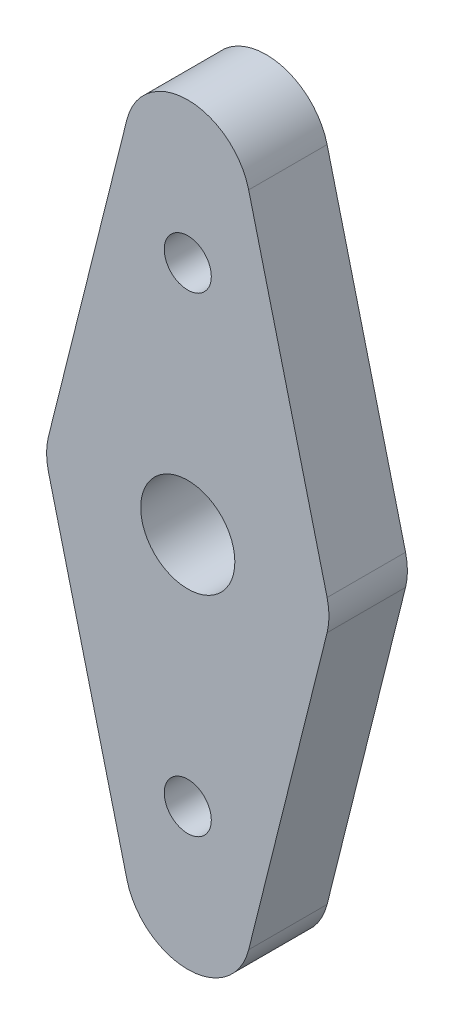
ISO-10303-21;
HEADER;
FILE_DESCRIPTION(('STEP AP214'),'2;1');
FILE_NAME('part.step','',(''),(''),'','','');
FILE_SCHEMA(('AUTOMOTIVE_DESIGN { 1 0 10303 214 1 1 1 1 }'));
ENDSEC;
DATA;
#1=APPLICATION_CONTEXT('core data for automotive mechanical design processes');
#2=APPLICATION_PROTOCOL_DEFINITION('international standard','automotive_design',2000,#1);
#3=PRODUCT_CONTEXT('',#1,'mechanical');
#4=PRODUCT('Part','Part','',(#3));
#5=PRODUCT_RELATED_PRODUCT_CATEGORY('part','',(#4));
#6=PRODUCT_DEFINITION_FORMATION('','',#4);
#7=PRODUCT_DEFINITION_CONTEXT('part definition',#1,'design');
#8=PRODUCT_DEFINITION('design','',#6,#7);
#9=PRODUCT_DEFINITION_SHAPE('','',#8);
#10=(LENGTH_UNIT() NAMED_UNIT(*) SI_UNIT(.MILLI.,.METRE.));
#11=(NAMED_UNIT(*) PLANE_ANGLE_UNIT() SI_UNIT($,.RADIAN.));
#12=(NAMED_UNIT(*) SI_UNIT($,.STERADIAN.) SOLID_ANGLE_UNIT());
#13=UNCERTAINTY_MEASURE_WITH_UNIT(LENGTH_MEASURE(1.E-05),#10,'distance_accuracy_value','');
#14=(GEOMETRIC_REPRESENTATION_CONTEXT(3) GLOBAL_UNCERTAINTY_ASSIGNED_CONTEXT((#13)) GLOBAL_UNIT_ASSIGNED_CONTEXT((#10,
#11,#12)) REPRESENTATION_CONTEXT('',''));
#15=CARTESIAN_POINT('',(0.,0.,0.));
#16=DIRECTION('',(0.,0.,1.));
#17=DIRECTION('',(1.,0.,0.));
#18=AXIS2_PLACEMENT_3D('',#15,#16,#17);
#19=CARTESIAN_POINT('',(0.,20.,5.));
#20=DIRECTION('',(0.,0.,-1.));
#21=DIRECTION('',(-1.,0.,0.));
#22=AXIS2_PLACEMENT_3D('',#19,#20,#21);
#23=CYLINDRICAL_SURFACE('',#22,4.);
#24=CARTESIAN_POINT('',(0.,20.,0.));
#25=DIRECTION('',(0.,0.,1.));
#26=DIRECTION('',(1.,0.,0.));
#27=AXIS2_PLACEMENT_3D('',#24,#25,#26);
#28=CIRCLE('',#27,4.);
#29=CARTESIAN_POINT('',(3.88057000058133,20.9701425001453,0.));
#30=VERTEX_POINT('',#29);
#31=CARTESIAN_POINT('',(-3.88057000058133,20.9701425001453,0.));
#32=VERTEX_POINT('',#31);
#33=EDGE_CURVE('E129',#30,#32,#28,.T.);
#34=ORIENTED_EDGE('',*,*,#33,.T.);
#35=DIRECTION('',(0.,0.,-1.));
#36=VECTOR('',#35,1.);
#37=CARTESIAN_POINT('',(-3.88057000058133,20.9701425001453,5.));
#38=LINE('',#37,#36);
#39=CARTESIAN_POINT('',(-3.88057000058133,20.9701425001453,5.));
#40=VERTEX_POINT('',#39);
#41=EDGE_CURVE('E11',#40,#32,#38,.T.);
#42=ORIENTED_EDGE('',*,*,#41,.F.);
#43=CARTESIAN_POINT('',(0.,20.,5.));
#44=DIRECTION('',(0.,0.,1.));
#45=DIRECTION('',(1.,0.,0.));
#46=AXIS2_PLACEMENT_3D('',#43,#44,#45);
#47=CIRCLE('',#46,4.);
#48=CARTESIAN_POINT('',(3.88057000058133,20.9701425001453,5.));
#49=VERTEX_POINT('',#48);
#50=EDGE_CURVE('E144',#49,#40,#47,.T.);
#51=ORIENTED_EDGE('',*,*,#50,.F.);
#52=DIRECTION('',(0.,0.,-1.));
#53=VECTOR('',#52,1.);
#54=CARTESIAN_POINT('',(3.88057000058133,20.9701425001453,5.));
#55=LINE('',#54,#53);
#56=EDGE_CURVE('E125',#49,#30,#55,.T.);
#57=ORIENTED_EDGE('',*,*,#56,.T.);
#58=EDGE_LOOP('',(#34,#42,#51,#57));
#59=FACE_BOUND('',#58,.T.);
#60=ADVANCED_FACE('F31',(#59),#23,.T.);
#61=CARTESIAN_POINT('',(-3.88057000058133,20.9701425001453,5.));
#62=DIRECTION('',(0.970142500145332,-0.242535625036333,0.));
#63=DIRECTION('',(0.242535625036333,0.970142500145332,0.));
#64=AXIS2_PLACEMENT_3D('',#61,#62,#63);
#65=PLANE('',#64);
#66=DIRECTION('',(-0.242535625036333,-0.970142500145332,0.));
#67=VECTOR('',#66,1.);
#68=CARTESIAN_POINT('',(-3.88057000058133,20.9701425001453,0.));
#69=LINE('',#68,#67);
#70=CARTESIAN_POINT('',(-8.88057000058133,0.970142500145331,0.));
#71=VERTEX_POINT('',#70);
#72=EDGE_CURVE('E132',#32,#71,#69,.T.);
#73=ORIENTED_EDGE('',*,*,#72,.T.);
#74=DIRECTION('',(0.,0.,-1.));
#75=VECTOR('',#74,1.);
#76=CARTESIAN_POINT('',(-8.88057000058133,0.970142500145331,5.));
#77=LINE('',#76,#75);
#78=CARTESIAN_POINT('',(-8.88057000058133,0.970142500145331,5.));
#79=VERTEX_POINT('',#78);
#80=EDGE_CURVE('E40',#79,#71,#77,.T.);
#81=ORIENTED_EDGE('',*,*,#80,.F.);
#82=DIRECTION('',(-0.242535625036333,-0.970142500145332,0.));
#83=VECTOR('',#82,1.);
#84=CARTESIAN_POINT('',(-3.88057000058133,20.9701425001453,5.));
#85=LINE('',#84,#83);
#86=EDGE_CURVE('E92',#40,#79,#85,.T.);
#87=ORIENTED_EDGE('',*,*,#86,.F.);
#88=ORIENTED_EDGE('',*,*,#41,.T.);
#89=EDGE_LOOP('',(#73,#81,#87,#88));
#90=FACE_BOUND('',#89,.T.);
#91=ADVANCED_FACE('F207',(#90),#65,.F.);
#92=CARTESIAN_POINT('',(-5.,0.,5.));
#93=DIRECTION('',(0.,0.,-1.));
#94=DIRECTION('',(-1.,0.,0.));
#95=AXIS2_PLACEMENT_3D('',#92,#93,#94);
#96=CYLINDRICAL_SURFACE('',#95,4.);
#97=CARTESIAN_POINT('',(-5.,0.,0.));
#98=DIRECTION('',(0.,0.,1.));
#99=DIRECTION('',(1.,0.,0.));
#100=AXIS2_PLACEMENT_3D('',#97,#98,#99);
#101=CIRCLE('',#100,4.);
#102=CARTESIAN_POINT('',(-8.88057000058133,-0.970142500145331,0.));
#103=VERTEX_POINT('',#102);
#104=EDGE_CURVE('E135',#71,#103,#101,.T.);
#105=ORIENTED_EDGE('',*,*,#104,.T.);
#106=DIRECTION('',(0.,0.,-1.));
#107=VECTOR('',#106,1.);
#108=CARTESIAN_POINT('',(-8.88057000058133,-0.970142500145331,5.));
#109=LINE('',#108,#107);
#110=CARTESIAN_POINT('',(-8.88057000058133,-0.970142500145331,5.));
#111=VERTEX_POINT('',#110);
#112=EDGE_CURVE('E151',#111,#103,#109,.T.);
#113=ORIENTED_EDGE('',*,*,#112,.F.);
#114=CARTESIAN_POINT('',(-5.,0.,5.));
#115=DIRECTION('',(0.,0.,1.));
#116=DIRECTION('',(1.,0.,0.));
#117=AXIS2_PLACEMENT_3D('',#114,#115,#116);
#118=CIRCLE('',#117,4.);
#119=EDGE_CURVE('E175',#79,#111,#118,.T.);
#120=ORIENTED_EDGE('',*,*,#119,.F.);
#121=ORIENTED_EDGE('',*,*,#80,.T.);
#122=EDGE_LOOP('',(#105,#113,#120,#121));
#123=FACE_BOUND('',#122,.T.);
#124=ADVANCED_FACE('F211',(#123),#96,.T.);
#125=CARTESIAN_POINT('',(-8.88057000058133,-0.970142500145331,5.));
#126=DIRECTION('',(0.970142500145332,0.242535625036333,0.));
#127=DIRECTION('',(-0.242535625036333,0.970142500145332,0.));
#128=AXIS2_PLACEMENT_3D('',#125,#126,#127);
#129=PLANE('',#128);
#130=DIRECTION('',(0.242535625036333,-0.970142500145332,0.));
#131=VECTOR('',#130,1.);
#132=CARTESIAN_POINT('',(-8.88057000058133,-0.970142500145331,0.));
#133=LINE('',#132,#131);
#134=CARTESIAN_POINT('',(-3.88057000058132,-20.9701425001453,0.));
#135=VERTEX_POINT('',#134);
#136=EDGE_CURVE('E137',#103,#135,#133,.T.);
#137=ORIENTED_EDGE('',*,*,#136,.T.);
#138=DIRECTION('',(0.,0.,-1.));
#139=VECTOR('',#138,1.);
#140=CARTESIAN_POINT('',(-3.88057000058132,-20.9701425001453,5.));
#141=LINE('',#140,#139);
#142=CARTESIAN_POINT('',(-3.88057000058132,-20.9701425001453,5.));
#143=VERTEX_POINT('',#142);
#144=EDGE_CURVE('E148',#143,#135,#141,.T.);
#145=ORIENTED_EDGE('',*,*,#144,.F.);
#146=DIRECTION('',(0.242535625036333,-0.970142500145332,0.));
#147=VECTOR('',#146,1.);
#148=CARTESIAN_POINT('',(-8.88057000058133,-0.970142500145331,5.));
#149=LINE('',#148,#147);
#150=EDGE_CURVE('E177',#111,#143,#149,.T.);
#151=ORIENTED_EDGE('',*,*,#150,.F.);
#152=ORIENTED_EDGE('',*,*,#112,.T.);
#153=EDGE_LOOP('',(#137,#145,#151,#152));
#154=FACE_BOUND('',#153,.T.);
#155=ADVANCED_FACE('F183',(#154),#129,.F.);
#156=CARTESIAN_POINT('',(0.,-20.,5.));
#157=DIRECTION('',(0.,0.,-1.));
#158=DIRECTION('',(-1.,0.,0.));
#159=AXIS2_PLACEMENT_3D('',#156,#157,#158);
#160=CYLINDRICAL_SURFACE('',#159,4.);
#161=CARTESIAN_POINT('',(0.,-20.,0.));
#162=DIRECTION('',(0.,0.,1.));
#163=DIRECTION('',(1.,0.,0.));
#164=AXIS2_PLACEMENT_3D('',#161,#162,#163);
#165=CIRCLE('',#164,4.);
#166=CARTESIAN_POINT('',(3.88057000058133,-20.9701425001453,0.));
#167=VERTEX_POINT('',#166);
#168=EDGE_CURVE('E139',#135,#167,#165,.T.);
#169=ORIENTED_EDGE('',*,*,#168,.T.);
#170=DIRECTION('',(0.,0.,-1.));
#171=VECTOR('',#170,1.);
#172=CARTESIAN_POINT('',(3.88057000058133,-20.9701425001453,5.));
#173=LINE('',#172,#171);
#174=CARTESIAN_POINT('',(3.88057000058133,-20.9701425001453,5.));
#175=VERTEX_POINT('',#174);
#176=EDGE_CURVE('E120',#175,#167,#173,.T.);
#177=ORIENTED_EDGE('',*,*,#176,.F.);
#178=CARTESIAN_POINT('',(0.,-20.,5.));
#179=DIRECTION('',(0.,0.,1.));
#180=DIRECTION('',(1.,0.,0.));
#181=AXIS2_PLACEMENT_3D('',#178,#179,#180);
#182=CIRCLE('',#181,4.);
#183=EDGE_CURVE('E111',#143,#175,#182,.T.);
#184=ORIENTED_EDGE('',*,*,#183,.F.);
#185=ORIENTED_EDGE('',*,*,#144,.T.);
#186=EDGE_LOOP('',(#169,#177,#184,#185));
#187=FACE_BOUND('',#186,.T.);
#188=ADVANCED_FACE('F187',(#187),#160,.T.);
#189=CARTESIAN_POINT('',(3.88057000058133,-20.9701425001453,5.));
#190=DIRECTION('',(-0.970142500145332,0.242535625036333,0.));
#191=DIRECTION('',(-0.242535625036333,-0.970142500145332,0.));
#192=AXIS2_PLACEMENT_3D('',#189,#190,#191);
#193=PLANE('',#192);
#194=DIRECTION('',(0.242535625036333,0.970142500145332,0.));
#195=VECTOR('',#194,1.);
#196=CARTESIAN_POINT('',(3.88057000058133,-20.9701425001453,0.));
#197=LINE('',#196,#195);
#198=CARTESIAN_POINT('',(8.88057000058133,-0.970142500145331,0.));
#199=VERTEX_POINT('',#198);
#200=EDGE_CURVE('E119',#167,#199,#197,.T.);
#201=ORIENTED_EDGE('',*,*,#200,.T.);
#202=DIRECTION('',(0.,0.,-1.));
#203=VECTOR('',#202,1.);
#204=CARTESIAN_POINT('',(8.88057000058133,-0.970142500145331,5.));
#205=LINE('',#204,#203);
#206=CARTESIAN_POINT('',(8.88057000058133,-0.970142500145331,5.));
#207=VERTEX_POINT('',#206);
#208=EDGE_CURVE('E116',#207,#199,#205,.T.);
#209=ORIENTED_EDGE('',*,*,#208,.F.);
#210=DIRECTION('',(0.242535625036333,0.970142500145332,0.));
#211=VECTOR('',#210,1.);
#212=CARTESIAN_POINT('',(3.88057000058133,-20.9701425001453,5.));
#213=LINE('',#212,#211);
#214=EDGE_CURVE('E105',#175,#207,#213,.T.);
#215=ORIENTED_EDGE('',*,*,#214,.F.);
#216=ORIENTED_EDGE('',*,*,#176,.T.);
#217=EDGE_LOOP('',(#201,#209,#215,#216));
#218=FACE_BOUND('',#217,.T.);
#219=ADVANCED_FACE('F117',(#218),#193,.F.);
#220=CARTESIAN_POINT('',(5.,0.,5.));
#221=DIRECTION('',(0.,0.,-1.));
#222=DIRECTION('',(-1.,0.,0.));
#223=AXIS2_PLACEMENT_3D('',#220,#221,#222);
#224=CYLINDRICAL_SURFACE('',#223,4.);
#225=CARTESIAN_POINT('',(5.,0.,0.));
#226=DIRECTION('',(0.,0.,1.));
#227=DIRECTION('',(1.,0.,0.));
#228=AXIS2_PLACEMENT_3D('',#225,#226,#227);
#229=CIRCLE('',#228,4.);
#230=CARTESIAN_POINT('',(8.88057000058133,0.970142500145332,0.));
#231=VERTEX_POINT('',#230);
#232=EDGE_CURVE('E78',#199,#231,#229,.T.);
#233=ORIENTED_EDGE('',*,*,#232,.T.);
#234=DIRECTION('',(0.,0.,-1.));
#235=VECTOR('',#234,1.);
#236=CARTESIAN_POINT('',(8.88057000058133,0.970142500145332,5.));
#237=LINE('',#236,#235);
#238=CARTESIAN_POINT('',(8.88057000058133,0.970142500145332,5.));
#239=VERTEX_POINT('',#238);
#240=EDGE_CURVE('E121',#239,#231,#237,.T.);
#241=ORIENTED_EDGE('',*,*,#240,.F.);
#242=CARTESIAN_POINT('',(5.,0.,5.));
#243=DIRECTION('',(0.,0.,1.));
#244=DIRECTION('',(1.,0.,0.));
#245=AXIS2_PLACEMENT_3D('',#242,#243,#244);
#246=CIRCLE('',#245,4.);
#247=EDGE_CURVE('E109',#207,#239,#246,.T.);
#248=ORIENTED_EDGE('',*,*,#247,.F.);
#249=ORIENTED_EDGE('',*,*,#208,.T.);
#250=EDGE_LOOP('',(#233,#241,#248,#249));
#251=FACE_BOUND('',#250,.T.);
#252=ADVANCED_FACE('F123',(#251),#224,.T.);
#253=CARTESIAN_POINT('',(8.88057000058133,0.970142500145331,5.));
#254=DIRECTION('',(-0.970142500145332,-0.242535625036333,0.));
#255=DIRECTION('',(0.242535625036333,-0.970142500145332,0.));
#256=AXIS2_PLACEMENT_3D('',#253,#254,#255);
#257=PLANE('',#256);
#258=DIRECTION('',(-0.242535625036333,0.970142500145332,0.));
#259=VECTOR('',#258,1.);
#260=CARTESIAN_POINT('',(8.88057000058133,0.970142500145331,0.));
#261=LINE('',#260,#259);
#262=EDGE_CURVE('E84',#231,#30,#261,.T.);
#263=ORIENTED_EDGE('',*,*,#262,.T.);
#264=ORIENTED_EDGE('',*,*,#56,.F.);
#265=DIRECTION('',(-0.242535625036333,0.970142500145332,0.));
#266=VECTOR('',#265,1.);
#267=CARTESIAN_POINT('',(8.88057000058133,0.970142500145331,5.));
#268=LINE('',#267,#266);
#269=EDGE_CURVE('E49',#239,#49,#268,.T.);
#270=ORIENTED_EDGE('',*,*,#269,.F.);
#271=ORIENTED_EDGE('',*,*,#240,.T.);
#272=EDGE_LOOP('',(#263,#264,#270,#271));
#273=FACE_BOUND('',#272,.T.);
#274=ADVANCED_FACE('F195',(#273),#257,.F.);
#275=CARTESIAN_POINT('',(0.,20.,5.));
#276=DIRECTION('',(0.,0.,1.));
#277=DIRECTION('',(1.,0.,0.));
#278=AXIS2_PLACEMENT_3D('',#275,#276,#277);
#279=PLANE('',#278);
#280=CARTESIAN_POINT('',(0.,-15.,5.));
#281=DIRECTION('',(0.,0.,1.));
#282=DIRECTION('',(1.,0.,0.));
#283=AXIS2_PLACEMENT_3D('',#280,#281,#282);
#284=CIRCLE('',#283,1.5);
#285=CARTESIAN_POINT('',(1.5,-15.,5.));
#286=VERTEX_POINT('',#285);
#287=EDGE_CURVE('E168',#286,#286,#284,.T.);
#288=ORIENTED_EDGE('',*,*,#287,.F.);
#289=EDGE_LOOP('',(#288));
#290=FACE_BOUND('',#289,.T.);
#291=CARTESIAN_POINT('',(0.,15.,5.));
#292=DIRECTION('',(0.,0.,1.));
#293=DIRECTION('',(1.,0.,0.));
#294=AXIS2_PLACEMENT_3D('',#291,#292,#293);
#295=CIRCLE('',#294,1.5);
#296=CARTESIAN_POINT('',(1.5,15.,5.));
#297=VERTEX_POINT('',#296);
#298=EDGE_CURVE('E158',#297,#297,#295,.T.);
#299=ORIENTED_EDGE('',*,*,#298,.F.);
#300=EDGE_LOOP('',(#299));
#301=FACE_BOUND('',#300,.T.);
#302=CARTESIAN_POINT('',(0.,0.,5.));
#303=DIRECTION('',(0.,0.,1.));
#304=DIRECTION('',(1.,0.,0.));
#305=AXIS2_PLACEMENT_3D('',#302,#303,#304);
#306=CIRCLE('',#305,3.);
#307=CARTESIAN_POINT('',(3.,0.,5.));
#308=VERTEX_POINT('',#307);
#309=EDGE_CURVE('E157',#308,#308,#306,.T.);
#310=ORIENTED_EDGE('',*,*,#309,.F.);
#311=EDGE_LOOP('',(#310));
#312=FACE_BOUND('',#311,.T.);
#313=ORIENTED_EDGE('',*,*,#50,.T.);
#314=ORIENTED_EDGE('',*,*,#86,.T.);
#315=ORIENTED_EDGE('',*,*,#119,.T.);
#316=ORIENTED_EDGE('',*,*,#150,.T.);
#317=ORIENTED_EDGE('',*,*,#183,.T.);
#318=ORIENTED_EDGE('',*,*,#214,.T.);
#319=ORIENTED_EDGE('',*,*,#247,.T.);
#320=ORIENTED_EDGE('',*,*,#269,.T.);
#321=EDGE_LOOP('',(#313,#314,#315,#316,#317,#318,#319,#320));
#322=FACE_BOUND('',#321,.T.);
#323=ADVANCED_FACE('F107',(#290,#301,#312,#322),#279,.T.);
#324=CARTESIAN_POINT('',(0.,20.,0.));
#325=DIRECTION('',(0.,0.,1.));
#326=DIRECTION('',(1.,0.,0.));
#327=AXIS2_PLACEMENT_3D('',#324,#325,#326);
#328=PLANE('',#327);
#329=CARTESIAN_POINT('',(0.,-15.,0.));
#330=DIRECTION('',(0.,0.,1.));
#331=DIRECTION('',(1.,0.,0.));
#332=AXIS2_PLACEMENT_3D('',#329,#330,#331);
#333=CIRCLE('',#332,1.5);
#334=CARTESIAN_POINT('',(1.5,-15.,0.));
#335=VERTEX_POINT('',#334);
#336=EDGE_CURVE('E34',#335,#335,#333,.T.);
#337=ORIENTED_EDGE('',*,*,#336,.T.);
#338=EDGE_LOOP('',(#337));
#339=FACE_BOUND('',#338,.T.);
#340=CARTESIAN_POINT('',(0.,15.,0.));
#341=DIRECTION('',(0.,0.,1.));
#342=DIRECTION('',(1.,0.,0.));
#343=AXIS2_PLACEMENT_3D('',#340,#341,#342);
#344=CIRCLE('',#343,1.5);
#345=CARTESIAN_POINT('',(1.5,15.,0.));
#346=VERTEX_POINT('',#345);
#347=EDGE_CURVE('E155',#346,#346,#344,.T.);
#348=ORIENTED_EDGE('',*,*,#347,.T.);
#349=EDGE_LOOP('',(#348));
#350=FACE_BOUND('',#349,.T.);
#351=CARTESIAN_POINT('',(0.,0.,0.));
#352=DIRECTION('',(0.,0.,1.));
#353=DIRECTION('',(1.,0.,0.));
#354=AXIS2_PLACEMENT_3D('',#351,#352,#353);
#355=CIRCLE('',#354,3.);
#356=CARTESIAN_POINT('',(3.,0.,0.));
#357=VERTEX_POINT('',#356);
#358=EDGE_CURVE('E133',#357,#357,#355,.T.);
#359=ORIENTED_EDGE('',*,*,#358,.T.);
#360=EDGE_LOOP('',(#359));
#361=FACE_BOUND('',#360,.T.);
#362=ORIENTED_EDGE('',*,*,#33,.F.);
#363=ORIENTED_EDGE('',*,*,#262,.F.);
#364=ORIENTED_EDGE('',*,*,#232,.F.);
#365=ORIENTED_EDGE('',*,*,#200,.F.);
#366=ORIENTED_EDGE('',*,*,#168,.F.);
#367=ORIENTED_EDGE('',*,*,#136,.F.);
#368=ORIENTED_EDGE('',*,*,#104,.F.);
#369=ORIENTED_EDGE('',*,*,#72,.F.);
#370=EDGE_LOOP('',(#362,#363,#364,#365,#366,#367,#368,#369));
#371=FACE_BOUND('',#370,.T.);
#372=ADVANCED_FACE('F190',(#339,#350,#361,#371),#328,.F.);
#373=CARTESIAN_POINT('',(0.,0.,0.));
#374=DIRECTION('',(0.,0.,1.));
#375=DIRECTION('',(1.,0.,0.));
#376=AXIS2_PLACEMENT_3D('',#373,#374,#375);
#377=CYLINDRICAL_SURFACE('',#376,3.);
#378=ORIENTED_EDGE('',*,*,#358,.F.);
#379=EDGE_LOOP('',(#378));
#380=FACE_BOUND('',#379,.T.);
#381=ORIENTED_EDGE('',*,*,#309,.T.);
#382=EDGE_LOOP('',(#381));
#383=FACE_BOUND('',#382,.T.);
#384=ADVANCED_FACE('F241',(#380,#383),#377,.F.);
#385=CARTESIAN_POINT('',(0.,15.,-95.));
#386=DIRECTION('',(0.,0.,1.));
#387=DIRECTION('',(1.,0.,0.));
#388=AXIS2_PLACEMENT_3D('',#385,#386,#387);
#389=CYLINDRICAL_SURFACE('',#388,1.5);
#390=ORIENTED_EDGE('',*,*,#298,.T.);
#391=EDGE_LOOP('',(#390));
#392=FACE_BOUND('',#391,.T.);
#393=ORIENTED_EDGE('',*,*,#347,.F.);
#394=EDGE_LOOP('',(#393));
#395=FACE_BOUND('',#394,.T.);
#396=ADVANCED_FACE('F246',(#392,#395),#389,.F.);
#397=CARTESIAN_POINT('',(0.,-15.,-95.));
#398=DIRECTION('',(0.,0.,1.));
#399=DIRECTION('',(1.,0.,0.));
#400=AXIS2_PLACEMENT_3D('',#397,#398,#399);
#401=CYLINDRICAL_SURFACE('',#400,1.5);
#402=ORIENTED_EDGE('',*,*,#287,.T.);
#403=EDGE_LOOP('',(#402));
#404=FACE_BOUND('',#403,.T.);
#405=ORIENTED_EDGE('',*,*,#336,.F.);
#406=EDGE_LOOP('',(#405));
#407=FACE_BOUND('',#406,.T.);
#408=ADVANCED_FACE('F269',(#404,#407),#401,.F.);
#409=CLOSED_SHELL('',(#60,#91,#124,#155,#188,#219,#252,#274,#323,#372,#384,#396,#408));
#410=MANIFOLD_SOLID_BREP('B2',#409);
#411=ADVANCED_BREP_SHAPE_REPRESENTATION('',(#18,#410),#14);
#412=SHAPE_DEFINITION_REPRESENTATION(#9,#411);
ENDSEC;
END-ISO-10303-21;
